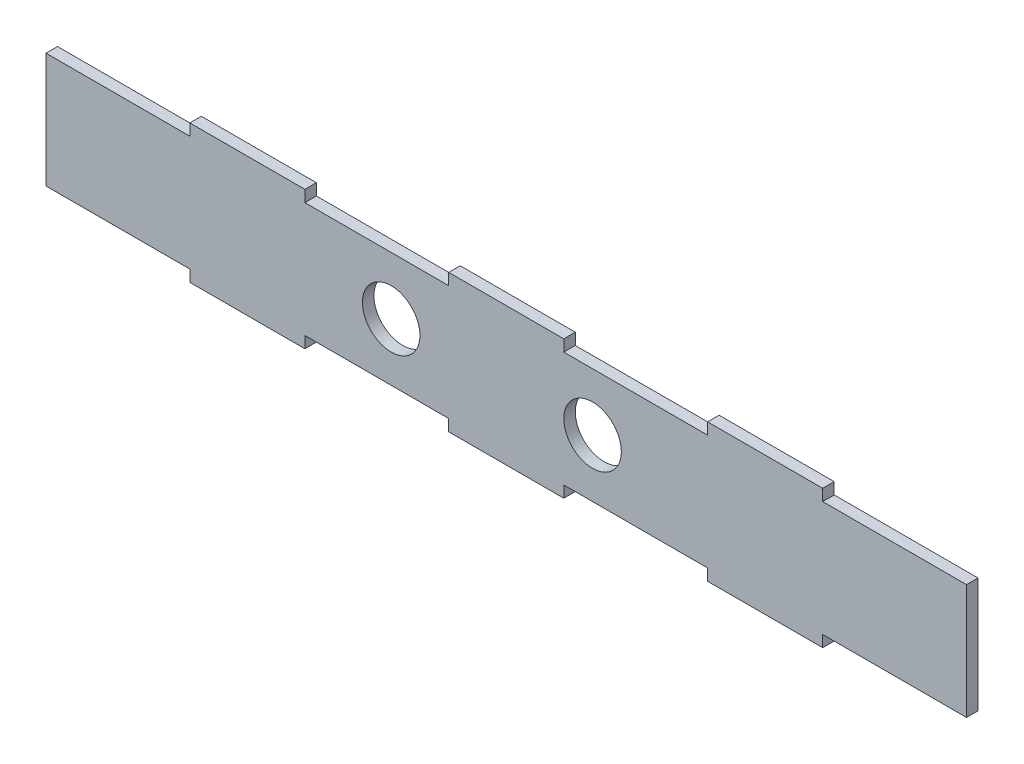
ISO-10303-21;
HEADER;
FILE_DESCRIPTION(('STEP AP214'),'2;1');
FILE_NAME('part.step','',(''),(''),'','','');
FILE_SCHEMA(('AUTOMOTIVE_DESIGN { 1 0 10303 214 1 1 1 1 }'));
ENDSEC;
DATA;
#1=APPLICATION_CONTEXT('core data for automotive mechanical design processes');
#2=APPLICATION_PROTOCOL_DEFINITION('international standard','automotive_design',2000,#1);
#3=PRODUCT_CONTEXT('',#1,'mechanical');
#4=PRODUCT('Part','Part','',(#3));
#5=PRODUCT_RELATED_PRODUCT_CATEGORY('part','',(#4));
#6=PRODUCT_DEFINITION_FORMATION('','',#4);
#7=PRODUCT_DEFINITION_CONTEXT('part definition',#1,'design');
#8=PRODUCT_DEFINITION('design','',#6,#7);
#9=PRODUCT_DEFINITION_SHAPE('','',#8);
#10=(LENGTH_UNIT() NAMED_UNIT(*) SI_UNIT(.MILLI.,.METRE.));
#11=(NAMED_UNIT(*) PLANE_ANGLE_UNIT() SI_UNIT($,.RADIAN.));
#12=(NAMED_UNIT(*) SI_UNIT($,.STERADIAN.) SOLID_ANGLE_UNIT());
#13=UNCERTAINTY_MEASURE_WITH_UNIT(LENGTH_MEASURE(1.E-05),#10,'distance_accuracy_value','');
#14=(GEOMETRIC_REPRESENTATION_CONTEXT(3) GLOBAL_UNCERTAINTY_ASSIGNED_CONTEXT((#13)) GLOBAL_UNIT_ASSIGNED_CONTEXT((#10,
#11,#12)) REPRESENTATION_CONTEXT('',''));
#15=CARTESIAN_POINT('',(0.,0.,0.));
#16=DIRECTION('',(0.,0.,1.));
#17=DIRECTION('',(1.,0.,0.));
#18=AXIS2_PLACEMENT_3D('',#15,#16,#17);
#19=CARTESIAN_POINT('',(0.,0.,2.));
#20=DIRECTION('',(0.,1.,0.));
#21=DIRECTION('',(0.,0.,1.));
#22=AXIS2_PLACEMENT_3D('',#19,#20,#21);
#23=PLANE('',#22);
#24=DIRECTION('',(1.,0.,0.));
#25=VECTOR('',#24,1.);
#26=CARTESIAN_POINT('',(0.,0.,0.));
#27=LINE('',#26,#25);
#28=CARTESIAN_POINT('',(115.,0.,0.));
#29=VERTEX_POINT('',#28);
#30=CARTESIAN_POINT('',(135.,0.,0.));
#31=VERTEX_POINT('',#30);
#32=EDGE_CURVE('E262',#29,#31,#27,.T.);
#33=ORIENTED_EDGE('',*,*,#32,.T.);
#34=DIRECTION('',(0.,0.,-1.));
#35=VECTOR('',#34,1.);
#36=CARTESIAN_POINT('',(135.,0.,2.));
#37=LINE('',#36,#35);
#38=CARTESIAN_POINT('',(135.,0.,2.));
#39=VERTEX_POINT('',#38);
#40=EDGE_CURVE('E11',#39,#31,#37,.T.);
#41=ORIENTED_EDGE('',*,*,#40,.F.);
#42=DIRECTION('',(1.,0.,0.));
#43=VECTOR('',#42,1.);
#44=CARTESIAN_POINT('',(0.,0.,2.));
#45=LINE('',#44,#43);
#46=CARTESIAN_POINT('',(115.,0.,2.));
#47=VERTEX_POINT('',#46);
#48=EDGE_CURVE('E454',#47,#39,#45,.T.);
#49=ORIENTED_EDGE('',*,*,#48,.F.);
#50=DIRECTION('',(0.,0.,-1.));
#51=VECTOR('',#50,1.);
#52=CARTESIAN_POINT('',(115.,0.,2.));
#53=LINE('',#52,#51);
#54=EDGE_CURVE('E54',#47,#29,#53,.T.);
#55=ORIENTED_EDGE('',*,*,#54,.T.);
#56=EDGE_LOOP('',(#33,#41,#49,#55));
#57=FACE_BOUND('',#56,.T.);
#58=ADVANCED_FACE('F37',(#57),#23,.F.);
#59=CARTESIAN_POINT('',(135.,0.,2.));
#60=DIRECTION('',(-1.,0.,0.));
#61=DIRECTION('',(0.,0.,1.));
#62=AXIS2_PLACEMENT_3D('',#59,#60,#61);
#63=PLANE('',#62);
#64=DIRECTION('',(0.,1.,0.));
#65=VECTOR('',#64,1.);
#66=CARTESIAN_POINT('',(135.,0.,0.));
#67=LINE('',#66,#65);
#68=CARTESIAN_POINT('',(135.,2.,0.));
#69=VERTEX_POINT('',#68);
#70=EDGE_CURVE('E264',#31,#69,#67,.T.);
#71=ORIENTED_EDGE('',*,*,#70,.T.);
#72=DIRECTION('',(0.,0.,-1.));
#73=VECTOR('',#72,1.);
#74=CARTESIAN_POINT('',(135.,2.,2.));
#75=LINE('',#74,#73);
#76=CARTESIAN_POINT('',(135.,2.,2.));
#77=VERTEX_POINT('',#76);
#78=EDGE_CURVE('E46',#77,#69,#75,.T.);
#79=ORIENTED_EDGE('',*,*,#78,.F.);
#80=DIRECTION('',(0.,1.,0.));
#81=VECTOR('',#80,1.);
#82=CARTESIAN_POINT('',(135.,0.,2.));
#83=LINE('',#82,#81);
#84=EDGE_CURVE('E153',#39,#77,#83,.T.);
#85=ORIENTED_EDGE('',*,*,#84,.F.);
#86=ORIENTED_EDGE('',*,*,#40,.T.);
#87=EDGE_LOOP('',(#71,#79,#85,#86));
#88=FACE_BOUND('',#87,.T.);
#89=ADVANCED_FACE('F388',(#88),#63,.F.);
#90=CARTESIAN_POINT('',(0.,2.,2.));
#91=DIRECTION('',(0.,-1.,0.));
#92=DIRECTION('',(0.,0.,-1.));
#93=AXIS2_PLACEMENT_3D('',#90,#91,#92);
#94=PLANE('',#93);
#95=DIRECTION('',(-1.,0.,0.));
#96=VECTOR('',#95,1.);
#97=CARTESIAN_POINT('',(0.,2.,0.));
#98=LINE('',#97,#96);
#99=CARTESIAN_POINT('',(160.,2.,0.));
#100=VERTEX_POINT('',#99);
#101=EDGE_CURVE('E269',#100,#69,#98,.T.);
#102=ORIENTED_EDGE('',*,*,#101,.F.);
#103=DIRECTION('',(0.,0.,-1.));
#104=VECTOR('',#103,1.);
#105=CARTESIAN_POINT('',(160.,2.,2.));
#106=LINE('',#105,#104);
#107=CARTESIAN_POINT('',(160.,2.,2.));
#108=VERTEX_POINT('',#107);
#109=EDGE_CURVE('E381',#108,#100,#106,.T.);
#110=ORIENTED_EDGE('',*,*,#109,.F.);
#111=DIRECTION('',(-1.,0.,0.));
#112=VECTOR('',#111,1.);
#113=CARTESIAN_POINT('',(0.,2.,2.));
#114=LINE('',#113,#112);
#115=EDGE_CURVE('E387',#108,#77,#114,.T.);
#116=ORIENTED_EDGE('',*,*,#115,.T.);
#117=ORIENTED_EDGE('',*,*,#78,.T.);
#118=EDGE_LOOP('',(#102,#110,#116,#117));
#119=FACE_BOUND('',#118,.T.);
#120=ADVANCED_FACE('F385',(#119),#94,.T.);
#121=CARTESIAN_POINT('',(160.,0.,2.));
#122=DIRECTION('',(-1.,0.,0.));
#123=DIRECTION('',(0.,0.,1.));
#124=AXIS2_PLACEMENT_3D('',#121,#122,#123);
#125=PLANE('',#124);
#126=DIRECTION('',(0.,1.,0.));
#127=VECTOR('',#126,1.);
#128=CARTESIAN_POINT('',(160.,0.,0.));
#129=LINE('',#128,#127);
#130=CARTESIAN_POINT('',(160.,22.,0.));
#131=VERTEX_POINT('',#130);
#132=EDGE_CURVE('E272',#100,#131,#129,.T.);
#133=ORIENTED_EDGE('',*,*,#132,.T.);
#134=DIRECTION('',(0.,0.,-1.));
#135=VECTOR('',#134,1.);
#136=CARTESIAN_POINT('',(160.,22.,2.));
#137=LINE('',#136,#135);
#138=CARTESIAN_POINT('',(160.,22.,2.));
#139=VERTEX_POINT('',#138);
#140=EDGE_CURVE('E378',#139,#131,#137,.T.);
#141=ORIENTED_EDGE('',*,*,#140,.F.);
#142=DIRECTION('',(0.,1.,0.));
#143=VECTOR('',#142,1.);
#144=CARTESIAN_POINT('',(160.,0.,2.));
#145=LINE('',#144,#143);
#146=EDGE_CURVE('E406',#108,#139,#145,.T.);
#147=ORIENTED_EDGE('',*,*,#146,.F.);
#148=ORIENTED_EDGE('',*,*,#109,.T.);
#149=EDGE_LOOP('',(#133,#141,#147,#148));
#150=FACE_BOUND('',#149,.T.);
#151=ADVANCED_FACE('F396',(#150),#125,.F.);
#152=CARTESIAN_POINT('',(0.,22.,2.));
#153=DIRECTION('',(0.,-1.,0.));
#154=DIRECTION('',(0.,0.,-1.));
#155=AXIS2_PLACEMENT_3D('',#152,#153,#154);
#156=PLANE('',#155);
#157=DIRECTION('',(-1.,0.,0.));
#158=VECTOR('',#157,1.);
#159=CARTESIAN_POINT('',(0.,22.,0.));
#160=LINE('',#159,#158);
#161=CARTESIAN_POINT('',(135.,22.,0.));
#162=VERTEX_POINT('',#161);
#163=EDGE_CURVE('E274',#131,#162,#160,.T.);
#164=ORIENTED_EDGE('',*,*,#163,.T.);
#165=DIRECTION('',(0.,0.,-1.));
#166=VECTOR('',#165,1.);
#167=CARTESIAN_POINT('',(135.,22.,2.));
#168=LINE('',#167,#166);
#169=CARTESIAN_POINT('',(135.,22.,2.));
#170=VERTEX_POINT('',#169);
#171=EDGE_CURVE('E376',#170,#162,#168,.T.);
#172=ORIENTED_EDGE('',*,*,#171,.F.);
#173=DIRECTION('',(-1.,0.,0.));
#174=VECTOR('',#173,1.);
#175=CARTESIAN_POINT('',(0.,22.,2.));
#176=LINE('',#175,#174);
#177=EDGE_CURVE('E402',#139,#170,#176,.T.);
#178=ORIENTED_EDGE('',*,*,#177,.F.);
#179=ORIENTED_EDGE('',*,*,#140,.T.);
#180=EDGE_LOOP('',(#164,#172,#178,#179));
#181=FACE_BOUND('',#180,.T.);
#182=ADVANCED_FACE('F400',(#181),#156,.F.);
#183=CARTESIAN_POINT('',(135.,0.,2.));
#184=DIRECTION('',(1.,0.,0.));
#185=DIRECTION('',(0.,0.,-1.));
#186=AXIS2_PLACEMENT_3D('',#183,#184,#185);
#187=PLANE('',#186);
#188=DIRECTION('',(0.,-1.,0.));
#189=VECTOR('',#188,1.);
#190=CARTESIAN_POINT('',(135.,0.,0.));
#191=LINE('',#190,#189);
#192=CARTESIAN_POINT('',(135.,24.,0.));
#193=VERTEX_POINT('',#192);
#194=EDGE_CURVE('E277',#193,#162,#191,.T.);
#195=ORIENTED_EDGE('',*,*,#194,.F.);
#196=DIRECTION('',(0.,0.,-1.));
#197=VECTOR('',#196,1.);
#198=CARTESIAN_POINT('',(135.,24.,2.));
#199=LINE('',#198,#197);
#200=CARTESIAN_POINT('',(135.,24.,2.));
#201=VERTEX_POINT('',#200);
#202=EDGE_CURVE('E374',#201,#193,#199,.T.);
#203=ORIENTED_EDGE('',*,*,#202,.F.);
#204=DIRECTION('',(0.,-1.,0.));
#205=VECTOR('',#204,1.);
#206=CARTESIAN_POINT('',(135.,0.,2.));
#207=LINE('',#206,#205);
#208=EDGE_CURVE('E405',#201,#170,#207,.T.);
#209=ORIENTED_EDGE('',*,*,#208,.T.);
#210=ORIENTED_EDGE('',*,*,#171,.T.);
#211=EDGE_LOOP('',(#195,#203,#209,#210));
#212=FACE_BOUND('',#211,.T.);
#213=ADVANCED_FACE('F564',(#212),#187,.T.);
#214=CARTESIAN_POINT('',(0.,24.,2.));
#215=DIRECTION('',(0.,1.,0.));
#216=DIRECTION('',(0.,0.,1.));
#217=AXIS2_PLACEMENT_3D('',#214,#215,#216);
#218=PLANE('',#217);
#219=DIRECTION('',(1.,0.,0.));
#220=VECTOR('',#219,1.);
#221=CARTESIAN_POINT('',(0.,24.,0.));
#222=LINE('',#221,#220);
#223=CARTESIAN_POINT('',(115.,24.,0.));
#224=VERTEX_POINT('',#223);
#225=EDGE_CURVE('E280',#224,#193,#222,.T.);
#226=ORIENTED_EDGE('',*,*,#225,.F.);
#227=DIRECTION('',(0.,0.,-1.));
#228=VECTOR('',#227,1.);
#229=CARTESIAN_POINT('',(115.,24.,2.));
#230=LINE('',#229,#228);
#231=CARTESIAN_POINT('',(115.,24.,2.));
#232=VERTEX_POINT('',#231);
#233=EDGE_CURVE('E372',#232,#224,#230,.T.);
#234=ORIENTED_EDGE('',*,*,#233,.F.);
#235=DIRECTION('',(1.,0.,0.));
#236=VECTOR('',#235,1.);
#237=CARTESIAN_POINT('',(0.,24.,2.));
#238=LINE('',#237,#236);
#239=EDGE_CURVE('E408',#232,#201,#238,.T.);
#240=ORIENTED_EDGE('',*,*,#239,.T.);
#241=ORIENTED_EDGE('',*,*,#202,.T.);
#242=EDGE_LOOP('',(#226,#234,#240,#241));
#243=FACE_BOUND('',#242,.T.);
#244=ADVANCED_FACE('F559',(#243),#218,.T.);
#245=CARTESIAN_POINT('',(115.,0.,2.));
#246=DIRECTION('',(1.,0.,0.));
#247=DIRECTION('',(0.,0.,-1.));
#248=AXIS2_PLACEMENT_3D('',#245,#246,#247);
#249=PLANE('',#248);
#250=DIRECTION('',(0.,-1.,0.));
#251=VECTOR('',#250,1.);
#252=CARTESIAN_POINT('',(115.,0.,0.));
#253=LINE('',#252,#251);
#254=CARTESIAN_POINT('',(115.,22.,0.));
#255=VERTEX_POINT('',#254);
#256=EDGE_CURVE('E283',#224,#255,#253,.T.);
#257=ORIENTED_EDGE('',*,*,#256,.T.);
#258=DIRECTION('',(0.,0.,-1.));
#259=VECTOR('',#258,1.);
#260=CARTESIAN_POINT('',(115.,22.,2.));
#261=LINE('',#260,#259);
#262=CARTESIAN_POINT('',(115.,22.,2.));
#263=VERTEX_POINT('',#262);
#264=EDGE_CURVE('E370',#263,#255,#261,.T.);
#265=ORIENTED_EDGE('',*,*,#264,.F.);
#266=DIRECTION('',(0.,-1.,0.));
#267=VECTOR('',#266,1.);
#268=CARTESIAN_POINT('',(115.,0.,2.));
#269=LINE('',#268,#267);
#270=EDGE_CURVE('E415',#232,#263,#269,.T.);
#271=ORIENTED_EDGE('',*,*,#270,.F.);
#272=ORIENTED_EDGE('',*,*,#233,.T.);
#273=EDGE_LOOP('',(#257,#265,#271,#272));
#274=FACE_BOUND('',#273,.T.);
#275=ADVANCED_FACE('F565',(#274),#249,.F.);
#276=CARTESIAN_POINT('',(0.,22.,2.));
#277=DIRECTION('',(0.,1.,0.));
#278=DIRECTION('',(-1.,0.,0.));
#279=AXIS2_PLACEMENT_3D('',#276,#277,#278);
#280=PLANE('',#279);
#281=DIRECTION('',(1.,0.,0.));
#282=VECTOR('',#281,1.);
#283=CARTESIAN_POINT('',(0.,22.,0.));
#284=LINE('',#283,#282);
#285=CARTESIAN_POINT('',(90.,22.,0.));
#286=VERTEX_POINT('',#285);
#287=EDGE_CURVE('E288',#286,#255,#284,.T.);
#288=ORIENTED_EDGE('',*,*,#287,.F.);
#289=DIRECTION('',(0.,0.,-1.));
#290=VECTOR('',#289,1.);
#291=CARTESIAN_POINT('',(90.,22.,2.));
#292=LINE('',#291,#290);
#293=CARTESIAN_POINT('',(90.,22.,2.));
#294=VERTEX_POINT('',#293);
#295=EDGE_CURVE('E368',#294,#286,#292,.T.);
#296=ORIENTED_EDGE('',*,*,#295,.F.);
#297=DIRECTION('',(1.,0.,0.));
#298=VECTOR('',#297,1.);
#299=CARTESIAN_POINT('',(0.,22.,2.));
#300=LINE('',#299,#298);
#301=EDGE_CURVE('E419',#294,#263,#300,.T.);
#302=ORIENTED_EDGE('',*,*,#301,.T.);
#303=ORIENTED_EDGE('',*,*,#264,.T.);
#304=EDGE_LOOP('',(#288,#296,#302,#303));
#305=FACE_BOUND('',#304,.T.);
#306=ADVANCED_FACE('F553',(#305),#280,.T.);
#307=CARTESIAN_POINT('',(90.,0.,2.));
#308=DIRECTION('',(1.,0.,0.));
#309=DIRECTION('',(0.,0.,-1.));
#310=AXIS2_PLACEMENT_3D('',#307,#308,#309);
#311=PLANE('',#310);
#312=DIRECTION('',(0.,-1.,0.));
#313=VECTOR('',#312,1.);
#314=CARTESIAN_POINT('',(90.,0.,0.));
#315=LINE('',#314,#313);
#316=CARTESIAN_POINT('',(90.,24.,0.));
#317=VERTEX_POINT('',#316);
#318=EDGE_CURVE('E291',#317,#286,#315,.T.);
#319=ORIENTED_EDGE('',*,*,#318,.F.);
#320=DIRECTION('',(0.,0.,-1.));
#321=VECTOR('',#320,1.);
#322=CARTESIAN_POINT('',(90.,24.,2.));
#323=LINE('',#322,#321);
#324=CARTESIAN_POINT('',(90.,24.,2.));
#325=VERTEX_POINT('',#324);
#326=EDGE_CURVE('E366',#325,#317,#323,.T.);
#327=ORIENTED_EDGE('',*,*,#326,.F.);
#328=DIRECTION('',(0.,-1.,0.));
#329=VECTOR('',#328,1.);
#330=CARTESIAN_POINT('',(90.,0.,2.));
#331=LINE('',#330,#329);
#332=EDGE_CURVE('E422',#325,#294,#331,.T.);
#333=ORIENTED_EDGE('',*,*,#332,.T.);
#334=ORIENTED_EDGE('',*,*,#295,.T.);
#335=EDGE_LOOP('',(#319,#327,#333,#334));
#336=FACE_BOUND('',#335,.T.);
#337=ADVANCED_FACE('F549',(#336),#311,.T.);
#338=CARTESIAN_POINT('',(70.,24.,0.));
#339=VERTEX_POINT('',#338);
#340=EDGE_CURVE('E285',#339,#317,#222,.T.);
#341=ORIENTED_EDGE('',*,*,#340,.F.);
#342=DIRECTION('',(0.,0.,-1.));
#343=VECTOR('',#342,1.);
#344=CARTESIAN_POINT('',(70.,24.,2.));
#345=LINE('',#344,#343);
#346=CARTESIAN_POINT('',(70.,24.,2.));
#347=VERTEX_POINT('',#346);
#348=EDGE_CURVE('E364',#347,#339,#345,.T.);
#349=ORIENTED_EDGE('',*,*,#348,.F.);
#350=EDGE_CURVE('E417',#347,#325,#238,.T.);
#351=ORIENTED_EDGE('',*,*,#350,.T.);
#352=ORIENTED_EDGE('',*,*,#326,.T.);
#353=EDGE_LOOP('',(#341,#349,#351,#352));
#354=FACE_BOUND('',#353,.T.);
#355=ADVANCED_FACE('F543',(#354),#218,.T.);
#356=CARTESIAN_POINT('',(70.,0.,2.));
#357=DIRECTION('',(1.,0.,0.));
#358=DIRECTION('',(0.,0.,-1.));
#359=AXIS2_PLACEMENT_3D('',#356,#357,#358);
#360=PLANE('',#359);
#361=DIRECTION('',(0.,-1.,0.));
#362=VECTOR('',#361,1.);
#363=CARTESIAN_POINT('',(70.,0.,0.));
#364=LINE('',#363,#362);
#365=CARTESIAN_POINT('',(70.,22.,0.));
#366=VERTEX_POINT('',#365);
#367=EDGE_CURVE('E294',#339,#366,#364,.T.);
#368=ORIENTED_EDGE('',*,*,#367,.T.);
#369=DIRECTION('',(0.,0.,-1.));
#370=VECTOR('',#369,1.);
#371=CARTESIAN_POINT('',(70.,22.,2.));
#372=LINE('',#371,#370);
#373=CARTESIAN_POINT('',(70.,22.,2.));
#374=VERTEX_POINT('',#373);
#375=EDGE_CURVE('E362',#374,#366,#372,.T.);
#376=ORIENTED_EDGE('',*,*,#375,.F.);
#377=DIRECTION('',(0.,-1.,0.));
#378=VECTOR('',#377,1.);
#379=CARTESIAN_POINT('',(70.,0.,2.));
#380=LINE('',#379,#378);
#381=EDGE_CURVE('E425',#347,#374,#380,.T.);
#382=ORIENTED_EDGE('',*,*,#381,.F.);
#383=ORIENTED_EDGE('',*,*,#348,.T.);
#384=EDGE_LOOP('',(#368,#376,#382,#383));
#385=FACE_BOUND('',#384,.T.);
#386=ADVANCED_FACE('F700',(#385),#360,.F.);
#387=CARTESIAN_POINT('',(0.,22.,2.));
#388=DIRECTION('',(0.,1.,0.));
#389=DIRECTION('',(0.,0.,1.));
#390=AXIS2_PLACEMENT_3D('',#387,#388,#389);
#391=PLANE('',#390);
#392=DIRECTION('',(1.,0.,0.));
#393=VECTOR('',#392,1.);
#394=CARTESIAN_POINT('',(0.,22.,0.));
#395=LINE('',#394,#393);
#396=CARTESIAN_POINT('',(45.,22.,0.));
#397=VERTEX_POINT('',#396);
#398=EDGE_CURVE('E297',#397,#366,#395,.T.);
#399=ORIENTED_EDGE('',*,*,#398,.F.);
#400=DIRECTION('',(0.,0.,-1.));
#401=VECTOR('',#400,1.);
#402=CARTESIAN_POINT('',(45.,22.,2.));
#403=LINE('',#402,#401);
#404=CARTESIAN_POINT('',(45.,22.,2.));
#405=VERTEX_POINT('',#404);
#406=EDGE_CURVE('E360',#405,#397,#403,.T.);
#407=ORIENTED_EDGE('',*,*,#406,.F.);
#408=DIRECTION('',(1.,0.,0.));
#409=VECTOR('',#408,1.);
#410=CARTESIAN_POINT('',(0.,22.,2.));
#411=LINE('',#410,#409);
#412=EDGE_CURVE('E427',#405,#374,#411,.T.);
#413=ORIENTED_EDGE('',*,*,#412,.T.);
#414=ORIENTED_EDGE('',*,*,#375,.T.);
#415=EDGE_LOOP('',(#399,#407,#413,#414));
#416=FACE_BOUND('',#415,.T.);
#417=ADVANCED_FACE('F690',(#416),#391,.T.);
#418=CARTESIAN_POINT('',(45.,0.,2.));
#419=DIRECTION('',(1.,0.,0.));
#420=DIRECTION('',(0.,0.,-1.));
#421=AXIS2_PLACEMENT_3D('',#418,#419,#420);
#422=PLANE('',#421);
#423=DIRECTION('',(0.,-1.,0.));
#424=VECTOR('',#423,1.);
#425=CARTESIAN_POINT('',(45.,0.,0.));
#426=LINE('',#425,#424);
#427=CARTESIAN_POINT('',(45.,24.,0.));
#428=VERTEX_POINT('',#427);
#429=EDGE_CURVE('E300',#428,#397,#426,.T.);
#430=ORIENTED_EDGE('',*,*,#429,.F.);
#431=DIRECTION('',(0.,0.,-1.));
#432=VECTOR('',#431,1.);
#433=CARTESIAN_POINT('',(45.,24.,2.));
#434=LINE('',#433,#432);
#435=CARTESIAN_POINT('',(45.,24.,2.));
#436=VERTEX_POINT('',#435);
#437=EDGE_CURVE('E358',#436,#428,#434,.T.);
#438=ORIENTED_EDGE('',*,*,#437,.F.);
#439=DIRECTION('',(0.,-1.,0.));
#440=VECTOR('',#439,1.);
#441=CARTESIAN_POINT('',(45.,0.,2.));
#442=LINE('',#441,#440);
#443=EDGE_CURVE('E430',#436,#405,#442,.T.);
#444=ORIENTED_EDGE('',*,*,#443,.T.);
#445=ORIENTED_EDGE('',*,*,#406,.T.);
#446=EDGE_LOOP('',(#430,#438,#444,#445));
#447=FACE_BOUND('',#446,.T.);
#448=ADVANCED_FACE('F682',(#447),#422,.T.);
#449=CARTESIAN_POINT('',(25.,24.,0.));
#450=VERTEX_POINT('',#449);
#451=EDGE_CURVE('E284',#450,#428,#222,.T.);
#452=ORIENTED_EDGE('',*,*,#451,.F.);
#453=DIRECTION('',(0.,0.,-1.));
#454=VECTOR('',#453,1.);
#455=CARTESIAN_POINT('',(25.,24.,2.));
#456=LINE('',#455,#454);
#457=CARTESIAN_POINT('',(25.,24.,2.));
#458=VERTEX_POINT('',#457);
#459=EDGE_CURVE('E356',#458,#450,#456,.T.);
#460=ORIENTED_EDGE('',*,*,#459,.F.);
#461=EDGE_CURVE('E416',#458,#436,#238,.T.);
#462=ORIENTED_EDGE('',*,*,#461,.T.);
#463=ORIENTED_EDGE('',*,*,#437,.T.);
#464=EDGE_LOOP('',(#452,#460,#462,#463));
#465=FACE_BOUND('',#464,.T.);
#466=ADVANCED_FACE('F534',(#465),#218,.T.);
#467=CARTESIAN_POINT('',(25.,0.,2.));
#468=DIRECTION('',(1.,0.,0.));
#469=DIRECTION('',(0.,0.,-1.));
#470=AXIS2_PLACEMENT_3D('',#467,#468,#469);
#471=PLANE('',#470);
#472=DIRECTION('',(0.,-1.,0.));
#473=VECTOR('',#472,1.);
#474=CARTESIAN_POINT('',(25.,0.,0.));
#475=LINE('',#474,#473);
#476=CARTESIAN_POINT('',(25.,22.,0.));
#477=VERTEX_POINT('',#476);
#478=EDGE_CURVE('E303',#450,#477,#475,.T.);
#479=ORIENTED_EDGE('',*,*,#478,.T.);
#480=DIRECTION('',(0.,0.,-1.));
#481=VECTOR('',#480,1.);
#482=CARTESIAN_POINT('',(25.,22.,2.));
#483=LINE('',#482,#481);
#484=CARTESIAN_POINT('',(25.,22.,2.));
#485=VERTEX_POINT('',#484);
#486=EDGE_CURVE('E354',#485,#477,#483,.T.);
#487=ORIENTED_EDGE('',*,*,#486,.F.);
#488=DIRECTION('',(0.,-1.,0.));
#489=VECTOR('',#488,1.);
#490=CARTESIAN_POINT('',(25.,0.,2.));
#491=LINE('',#490,#489);
#492=EDGE_CURVE('E433',#458,#485,#491,.T.);
#493=ORIENTED_EDGE('',*,*,#492,.F.);
#494=ORIENTED_EDGE('',*,*,#459,.T.);
#495=EDGE_LOOP('',(#479,#487,#493,#494));
#496=FACE_BOUND('',#495,.T.);
#497=ADVANCED_FACE('F665',(#496),#471,.F.);
#498=CARTESIAN_POINT('',(0.,22.,2.));
#499=DIRECTION('',(0.,1.,0.));
#500=DIRECTION('',(0.,0.,1.));
#501=AXIS2_PLACEMENT_3D('',#498,#499,#500);
#502=PLANE('',#501);
#503=DIRECTION('',(1.,0.,0.));
#504=VECTOR('',#503,1.);
#505=CARTESIAN_POINT('',(0.,22.,0.));
#506=LINE('',#505,#504);
#507=CARTESIAN_POINT('',(0.,22.,0.));
#508=VERTEX_POINT('',#507);
#509=EDGE_CURVE('E306',#508,#477,#506,.T.);
#510=ORIENTED_EDGE('',*,*,#509,.F.);
#511=DIRECTION('',(0.,0.,-1.));
#512=VECTOR('',#511,1.);
#513=CARTESIAN_POINT('',(0.,22.,2.));
#514=LINE('',#513,#512);
#515=CARTESIAN_POINT('',(0.,22.,2.));
#516=VERTEX_POINT('',#515);
#517=EDGE_CURVE('E352',#516,#508,#514,.T.);
#518=ORIENTED_EDGE('',*,*,#517,.F.);
#519=DIRECTION('',(1.,0.,0.));
#520=VECTOR('',#519,1.);
#521=CARTESIAN_POINT('',(0.,22.,2.));
#522=LINE('',#521,#520);
#523=EDGE_CURVE('E435',#516,#485,#522,.T.);
#524=ORIENTED_EDGE('',*,*,#523,.T.);
#525=ORIENTED_EDGE('',*,*,#486,.T.);
#526=EDGE_LOOP('',(#510,#518,#524,#525));
#527=FACE_BOUND('',#526,.T.);
#528=ADVANCED_FACE('F527',(#527),#502,.T.);
#529=CARTESIAN_POINT('',(0.,0.,2.));
#530=DIRECTION('',(-1.,0.,0.));
#531=DIRECTION('',(0.,0.,1.));
#532=AXIS2_PLACEMENT_3D('',#529,#530,#531);
#533=PLANE('',#532);
#534=DIRECTION('',(0.,1.,0.));
#535=VECTOR('',#534,1.);
#536=CARTESIAN_POINT('',(0.,0.,0.));
#537=LINE('',#536,#535);
#538=CARTESIAN_POINT('',(0.,2.,0.));
#539=VERTEX_POINT('',#538);
#540=EDGE_CURVE('E309',#539,#508,#537,.T.);
#541=ORIENTED_EDGE('',*,*,#540,.F.);
#542=DIRECTION('',(0.,0.,-1.));
#543=VECTOR('',#542,1.);
#544=CARTESIAN_POINT('',(0.,2.,2.));
#545=LINE('',#544,#543);
#546=CARTESIAN_POINT('',(0.,2.,2.));
#547=VERTEX_POINT('',#546);
#548=EDGE_CURVE('E350',#547,#539,#545,.T.);
#549=ORIENTED_EDGE('',*,*,#548,.F.);
#550=DIRECTION('',(0.,1.,0.));
#551=VECTOR('',#550,1.);
#552=CARTESIAN_POINT('',(0.,0.,2.));
#553=LINE('',#552,#551);
#554=EDGE_CURVE('E438',#547,#516,#553,.T.);
#555=ORIENTED_EDGE('',*,*,#554,.T.);
#556=ORIENTED_EDGE('',*,*,#517,.T.);
#557=EDGE_LOOP('',(#541,#549,#555,#556));
#558=FACE_BOUND('',#557,.T.);
#559=ADVANCED_FACE('F523',(#558),#533,.T.);
#560=CARTESIAN_POINT('',(0.,2.,2.));
#561=DIRECTION('',(0.,1.,0.));
#562=DIRECTION('',(0.,0.,1.));
#563=AXIS2_PLACEMENT_3D('',#560,#561,#562);
#564=PLANE('',#563);
#565=DIRECTION('',(1.,0.,0.));
#566=VECTOR('',#565,1.);
#567=CARTESIAN_POINT('',(0.,2.,0.));
#568=LINE('',#567,#566);
#569=CARTESIAN_POINT('',(25.,2.,0.));
#570=VERTEX_POINT('',#569);
#571=EDGE_CURVE('E312',#539,#570,#568,.T.);
#572=ORIENTED_EDGE('',*,*,#571,.T.);
#573=DIRECTION('',(0.,0.,-1.));
#574=VECTOR('',#573,1.);
#575=CARTESIAN_POINT('',(25.,2.,2.));
#576=LINE('',#575,#574);
#577=CARTESIAN_POINT('',(25.,2.,2.));
#578=VERTEX_POINT('',#577);
#579=EDGE_CURVE('E348',#578,#570,#576,.T.);
#580=ORIENTED_EDGE('',*,*,#579,.F.);
#581=DIRECTION('',(1.,0.,0.));
#582=VECTOR('',#581,1.);
#583=CARTESIAN_POINT('',(0.,2.,2.));
#584=LINE('',#583,#582);
#585=EDGE_CURVE('E441',#547,#578,#584,.T.);
#586=ORIENTED_EDGE('',*,*,#585,.F.);
#587=ORIENTED_EDGE('',*,*,#548,.T.);
#588=EDGE_LOOP('',(#572,#580,#586,#587));
#589=FACE_BOUND('',#588,.T.);
#590=ADVANCED_FACE('F640',(#589),#564,.F.);
#591=CARTESIAN_POINT('',(25.,0.,2.));
#592=DIRECTION('',(-1.,0.,0.));
#593=DIRECTION('',(0.,0.,1.));
#594=AXIS2_PLACEMENT_3D('',#591,#592,#593);
#595=PLANE('',#594);
#596=DIRECTION('',(0.,1.,0.));
#597=VECTOR('',#596,1.);
#598=CARTESIAN_POINT('',(25.,0.,0.));
#599=LINE('',#598,#597);
#600=CARTESIAN_POINT('',(25.,0.,0.));
#601=VERTEX_POINT('',#600);
#602=EDGE_CURVE('E315',#601,#570,#599,.T.);
#603=ORIENTED_EDGE('',*,*,#602,.F.);
#604=DIRECTION('',(0.,0.,-1.));
#605=VECTOR('',#604,1.);
#606=CARTESIAN_POINT('',(25.,0.,2.));
#607=LINE('',#606,#605);
#608=CARTESIAN_POINT('',(25.,0.,2.));
#609=VERTEX_POINT('',#608);
#610=EDGE_CURVE('E346',#609,#601,#607,.T.);
#611=ORIENTED_EDGE('',*,*,#610,.F.);
#612=DIRECTION('',(0.,1.,0.));
#613=VECTOR('',#612,1.);
#614=CARTESIAN_POINT('',(25.,0.,2.));
#615=LINE('',#614,#613);
#616=EDGE_CURVE('E443',#609,#578,#615,.T.);
#617=ORIENTED_EDGE('',*,*,#616,.T.);
#618=ORIENTED_EDGE('',*,*,#579,.T.);
#619=EDGE_LOOP('',(#603,#611,#617,#618));
#620=FACE_BOUND('',#619,.T.);
#621=ADVANCED_FACE('F490',(#620),#595,.T.);
#622=CARTESIAN_POINT('',(45.,0.,0.));
#623=VERTEX_POINT('',#622);
#624=EDGE_CURVE('E266',#601,#623,#27,.T.);
#625=ORIENTED_EDGE('',*,*,#624,.T.);
#626=DIRECTION('',(0.,0.,-1.));
#627=VECTOR('',#626,1.);
#628=CARTESIAN_POINT('',(45.,0.,2.));
#629=LINE('',#628,#627);
#630=CARTESIAN_POINT('',(45.,0.,2.));
#631=VERTEX_POINT('',#630);
#632=EDGE_CURVE('E343',#631,#623,#629,.T.);
#633=ORIENTED_EDGE('',*,*,#632,.F.);
#634=EDGE_CURVE('E446',#609,#631,#45,.T.);
#635=ORIENTED_EDGE('',*,*,#634,.F.);
#636=ORIENTED_EDGE('',*,*,#610,.T.);
#637=EDGE_LOOP('',(#625,#633,#635,#636));
#638=FACE_BOUND('',#637,.T.);
#639=ADVANCED_FACE('F480',(#638),#23,.F.);
#640=CARTESIAN_POINT('',(45.,0.,2.));
#641=DIRECTION('',(-1.,0.,0.));
#642=DIRECTION('',(0.,0.,1.));
#643=AXIS2_PLACEMENT_3D('',#640,#641,#642);
#644=PLANE('',#643);
#645=DIRECTION('',(0.,1.,0.));
#646=VECTOR('',#645,1.);
#647=CARTESIAN_POINT('',(45.,0.,0.));
#648=LINE('',#647,#646);
#649=CARTESIAN_POINT('',(45.,2.,0.));
#650=VERTEX_POINT('',#649);
#651=EDGE_CURVE('E318',#623,#650,#648,.T.);
#652=ORIENTED_EDGE('',*,*,#651,.T.);
#653=DIRECTION('',(0.,0.,-1.));
#654=VECTOR('',#653,1.);
#655=CARTESIAN_POINT('',(45.,2.,2.));
#656=LINE('',#655,#654);
#657=CARTESIAN_POINT('',(45.,2.,2.));
#658=VERTEX_POINT('',#657);
#659=EDGE_CURVE('E340',#658,#650,#656,.T.);
#660=ORIENTED_EDGE('',*,*,#659,.F.);
#661=DIRECTION('',(0.,1.,0.));
#662=VECTOR('',#661,1.);
#663=CARTESIAN_POINT('',(45.,0.,2.));
#664=LINE('',#663,#662);
#665=EDGE_CURVE('E447',#631,#658,#664,.T.);
#666=ORIENTED_EDGE('',*,*,#665,.F.);
#667=ORIENTED_EDGE('',*,*,#632,.T.);
#668=EDGE_LOOP('',(#652,#660,#666,#667));
#669=FACE_BOUND('',#668,.T.);
#670=ADVANCED_FACE('F489',(#669),#644,.F.);
#671=CARTESIAN_POINT('',(0.,2.,2.));
#672=DIRECTION('',(0.,1.,0.));
#673=DIRECTION('',(0.,0.,1.));
#674=AXIS2_PLACEMENT_3D('',#671,#672,#673);
#675=PLANE('',#674);
#676=DIRECTION('',(1.,0.,0.));
#677=VECTOR('',#676,1.);
#678=CARTESIAN_POINT('',(0.,2.,0.));
#679=LINE('',#678,#677);
#680=CARTESIAN_POINT('',(70.,2.,0.));
#681=VERTEX_POINT('',#680);
#682=EDGE_CURVE('E320',#650,#681,#679,.T.);
#683=ORIENTED_EDGE('',*,*,#682,.T.);
#684=DIRECTION('',(0.,0.,-1.));
#685=VECTOR('',#684,1.);
#686=CARTESIAN_POINT('',(70.,2.,2.));
#687=LINE('',#686,#685);
#688=CARTESIAN_POINT('',(70.,2.,2.));
#689=VERTEX_POINT('',#688);
#690=EDGE_CURVE('E338',#689,#681,#687,.T.);
#691=ORIENTED_EDGE('',*,*,#690,.F.);
#692=DIRECTION('',(1.,0.,0.));
#693=VECTOR('',#692,1.);
#694=CARTESIAN_POINT('',(0.,2.,2.));
#695=LINE('',#694,#693);
#696=EDGE_CURVE('E449',#658,#689,#695,.T.);
#697=ORIENTED_EDGE('',*,*,#696,.F.);
#698=ORIENTED_EDGE('',*,*,#659,.T.);
#699=EDGE_LOOP('',(#683,#691,#697,#698));
#700=FACE_BOUND('',#699,.T.);
#701=ADVANCED_FACE('F499',(#700),#675,.F.);
#702=CARTESIAN_POINT('',(70.,0.,2.));
#703=DIRECTION('',(-1.,0.,0.));
#704=DIRECTION('',(0.,0.,1.));
#705=AXIS2_PLACEMENT_3D('',#702,#703,#704);
#706=PLANE('',#705);
#707=DIRECTION('',(0.,1.,0.));
#708=VECTOR('',#707,1.);
#709=CARTESIAN_POINT('',(70.,0.,0.));
#710=LINE('',#709,#708);
#711=CARTESIAN_POINT('',(70.,0.,0.));
#712=VERTEX_POINT('',#711);
#713=EDGE_CURVE('E323',#712,#681,#710,.T.);
#714=ORIENTED_EDGE('',*,*,#713,.F.);
#715=DIRECTION('',(0.,0.,-1.));
#716=VECTOR('',#715,1.);
#717=CARTESIAN_POINT('',(70.,0.,2.));
#718=LINE('',#717,#716);
#719=CARTESIAN_POINT('',(70.,0.,2.));
#720=VERTEX_POINT('',#719);
#721=EDGE_CURVE('E336',#720,#712,#718,.T.);
#722=ORIENTED_EDGE('',*,*,#721,.F.);
#723=DIRECTION('',(0.,1.,0.));
#724=VECTOR('',#723,1.);
#725=CARTESIAN_POINT('',(70.,0.,2.));
#726=LINE('',#725,#724);
#727=EDGE_CURVE('E450',#720,#689,#726,.T.);
#728=ORIENTED_EDGE('',*,*,#727,.T.);
#729=ORIENTED_EDGE('',*,*,#690,.T.);
#730=EDGE_LOOP('',(#714,#722,#728,#729));
#731=FACE_BOUND('',#730,.T.);
#732=ADVANCED_FACE('F493',(#731),#706,.T.);
#733=CARTESIAN_POINT('',(90.,0.,0.));
#734=VERTEX_POINT('',#733);
#735=EDGE_CURVE('E265',#712,#734,#27,.T.);
#736=ORIENTED_EDGE('',*,*,#735,.T.);
#737=DIRECTION('',(0.,0.,-1.));
#738=VECTOR('',#737,1.);
#739=CARTESIAN_POINT('',(90.,0.,2.));
#740=LINE('',#739,#738);
#741=CARTESIAN_POINT('',(90.,0.,2.));
#742=VERTEX_POINT('',#741);
#743=EDGE_CURVE('E248',#742,#734,#740,.T.);
#744=ORIENTED_EDGE('',*,*,#743,.F.);
#745=EDGE_CURVE('E236',#720,#742,#45,.T.);
#746=ORIENTED_EDGE('',*,*,#745,.F.);
#747=ORIENTED_EDGE('',*,*,#721,.T.);
#748=EDGE_LOOP('',(#736,#744,#746,#747));
#749=FACE_BOUND('',#748,.T.);
#750=ADVANCED_FACE('F481',(#749),#23,.F.);
#751=CARTESIAN_POINT('',(90.,0.,2.));
#752=DIRECTION('',(-1.,0.,0.));
#753=DIRECTION('',(0.,0.,1.));
#754=AXIS2_PLACEMENT_3D('',#751,#752,#753);
#755=PLANE('',#754);
#756=DIRECTION('',(0.,1.,0.));
#757=VECTOR('',#756,1.);
#758=CARTESIAN_POINT('',(90.,0.,0.));
#759=LINE('',#758,#757);
#760=CARTESIAN_POINT('',(90.,2.,0.));
#761=VERTEX_POINT('',#760);
#762=EDGE_CURVE('E245',#734,#761,#759,.T.);
#763=ORIENTED_EDGE('',*,*,#762,.T.);
#764=DIRECTION('',(0.,0.,-1.));
#765=VECTOR('',#764,1.);
#766=CARTESIAN_POINT('',(90.,2.,2.));
#767=LINE('',#766,#765);
#768=CARTESIAN_POINT('',(90.,2.,2.));
#769=VERTEX_POINT('',#768);
#770=EDGE_CURVE('E242',#769,#761,#767,.T.);
#771=ORIENTED_EDGE('',*,*,#770,.F.);
#772=DIRECTION('',(0.,1.,0.));
#773=VECTOR('',#772,1.);
#774=CARTESIAN_POINT('',(90.,0.,2.));
#775=LINE('',#774,#773);
#776=EDGE_CURVE('E228',#742,#769,#775,.T.);
#777=ORIENTED_EDGE('',*,*,#776,.F.);
#778=ORIENTED_EDGE('',*,*,#743,.T.);
#779=EDGE_LOOP('',(#763,#771,#777,#778));
#780=FACE_BOUND('',#779,.T.);
#781=ADVANCED_FACE('F243',(#780),#755,.F.);
#782=CARTESIAN_POINT('',(0.,2.,2.));
#783=DIRECTION('',(0.,1.,0.));
#784=DIRECTION('',(0.,0.,1.));
#785=AXIS2_PLACEMENT_3D('',#782,#783,#784);
#786=PLANE('',#785);
#787=DIRECTION('',(1.,0.,0.));
#788=VECTOR('',#787,1.);
#789=CARTESIAN_POINT('',(0.,2.,0.));
#790=LINE('',#789,#788);
#791=CARTESIAN_POINT('',(115.,2.,0.));
#792=VERTEX_POINT('',#791);
#793=EDGE_CURVE('E327',#761,#792,#790,.T.);
#794=ORIENTED_EDGE('',*,*,#793,.T.);
#795=DIRECTION('',(0.,0.,-1.));
#796=VECTOR('',#795,1.);
#797=CARTESIAN_POINT('',(115.,2.,2.));
#798=LINE('',#797,#796);
#799=CARTESIAN_POINT('',(115.,2.,2.));
#800=VERTEX_POINT('',#799);
#801=EDGE_CURVE('E141',#800,#792,#798,.T.);
#802=ORIENTED_EDGE('',*,*,#801,.F.);
#803=DIRECTION('',(1.,0.,0.));
#804=VECTOR('',#803,1.);
#805=CARTESIAN_POINT('',(0.,2.,2.));
#806=LINE('',#805,#804);
#807=EDGE_CURVE('E233',#769,#800,#806,.T.);
#808=ORIENTED_EDGE('',*,*,#807,.F.);
#809=ORIENTED_EDGE('',*,*,#770,.T.);
#810=EDGE_LOOP('',(#794,#802,#808,#809));
#811=FACE_BOUND('',#810,.T.);
#812=ADVANCED_FACE('F250',(#811),#786,.F.);
#813=CARTESIAN_POINT('',(95.,12.,2.));
#814=DIRECTION('',(0.,0.,-1.));
#815=DIRECTION('',(-1.,0.,0.));
#816=AXIS2_PLACEMENT_3D('',#813,#814,#815);
#817=CYLINDRICAL_SURFACE('',#816,5.);
#818=CARTESIAN_POINT('',(95.,12.,2.));
#819=DIRECTION('',(0.,0.,1.));
#820=DIRECTION('',(1.,0.,0.));
#821=AXIS2_PLACEMENT_3D('',#818,#819,#820);
#822=CIRCLE('',#821,5.);
#823=CARTESIAN_POINT('',(100.,12.,2.));
#824=VERTEX_POINT('',#823);
#825=EDGE_CURVE('E457',#824,#824,#822,.T.);
#826=ORIENTED_EDGE('',*,*,#825,.T.);
#827=EDGE_LOOP('',(#826));
#828=FACE_BOUND('',#827,.T.);
#829=CARTESIAN_POINT('',(95.,12.,0.));
#830=DIRECTION('',(0.,0.,1.));
#831=DIRECTION('',(1.,0.,0.));
#832=AXIS2_PLACEMENT_3D('',#829,#830,#831);
#833=CIRCLE('',#832,5.);
#834=CARTESIAN_POINT('',(100.,12.,0.));
#835=VERTEX_POINT('',#834);
#836=EDGE_CURVE('E259',#835,#835,#833,.T.);
#837=ORIENTED_EDGE('',*,*,#836,.F.);
#838=EDGE_LOOP('',(#837));
#839=FACE_BOUND('',#838,.T.);
#840=ADVANCED_FACE('F583',(#828,#839),#817,.F.);
#841=CARTESIAN_POINT('',(60.,12.,2.));
#842=DIRECTION('',(0.,0.,-1.));
#843=DIRECTION('',(-1.,0.,0.));
#844=AXIS2_PLACEMENT_3D('',#841,#842,#843);
#845=CYLINDRICAL_SURFACE('',#844,4.99999999999999);
#846=CARTESIAN_POINT('',(60.,12.,2.));
#847=DIRECTION('',(0.,0.,1.));
#848=DIRECTION('',(1.,0.,0.));
#849=AXIS2_PLACEMENT_3D('',#846,#847,#848);
#850=CIRCLE('',#849,4.99999999999999);
#851=CARTESIAN_POINT('',(65.,12.,2.));
#852=VERTEX_POINT('',#851);
#853=EDGE_CURVE('E332',#852,#852,#850,.T.);
#854=ORIENTED_EDGE('',*,*,#853,.T.);
#855=EDGE_LOOP('',(#854));
#856=FACE_BOUND('',#855,.T.);
#857=CARTESIAN_POINT('',(60.,12.,0.));
#858=DIRECTION('',(0.,0.,1.));
#859=DIRECTION('',(1.,0.,0.));
#860=AXIS2_PLACEMENT_3D('',#857,#858,#859);
#861=CIRCLE('',#860,4.99999999999999);
#862=CARTESIAN_POINT('',(65.,12.,0.));
#863=VERTEX_POINT('',#862);
#864=EDGE_CURVE('E256',#863,#863,#861,.T.);
#865=ORIENTED_EDGE('',*,*,#864,.F.);
#866=EDGE_LOOP('',(#865));
#867=FACE_BOUND('',#866,.T.);
#868=ADVANCED_FACE('F39',(#856,#867),#845,.F.);
#869=CARTESIAN_POINT('',(115.,0.,2.));
#870=DIRECTION('',(-1.,0.,0.));
#871=DIRECTION('',(0.,0.,1.));
#872=AXIS2_PLACEMENT_3D('',#869,#870,#871);
#873=PLANE('',#872);
#874=DIRECTION('',(0.,1.,0.));
#875=VECTOR('',#874,1.);
#876=CARTESIAN_POINT('',(115.,0.,0.));
#877=LINE('',#876,#875);
#878=EDGE_CURVE('E329',#29,#792,#877,.T.);
#879=ORIENTED_EDGE('',*,*,#878,.F.);
#880=ORIENTED_EDGE('',*,*,#54,.F.);
#881=DIRECTION('',(0.,1.,0.));
#882=VECTOR('',#881,1.);
#883=CARTESIAN_POINT('',(115.,0.,2.));
#884=LINE('',#883,#882);
#885=EDGE_CURVE('E251',#47,#800,#884,.T.);
#886=ORIENTED_EDGE('',*,*,#885,.T.);
#887=ORIENTED_EDGE('',*,*,#801,.T.);
#888=EDGE_LOOP('',(#879,#880,#886,#887));
#889=FACE_BOUND('',#888,.T.);
#890=ADVANCED_FACE('F469',(#889),#873,.T.);
#891=CARTESIAN_POINT('',(0.,0.,2.));
#892=DIRECTION('',(0.,0.,1.));
#893=DIRECTION('',(1.,0.,0.));
#894=AXIS2_PLACEMENT_3D('',#891,#892,#893);
#895=PLANE('',#894);
#896=ORIENTED_EDGE('',*,*,#853,.F.);
#897=EDGE_LOOP('',(#896));
#898=FACE_BOUND('',#897,.T.);
#899=ORIENTED_EDGE('',*,*,#825,.F.);
#900=EDGE_LOOP('',(#899));
#901=FACE_BOUND('',#900,.T.);
#902=ORIENTED_EDGE('',*,*,#48,.T.);
#903=ORIENTED_EDGE('',*,*,#84,.T.);
#904=ORIENTED_EDGE('',*,*,#115,.F.);
#905=ORIENTED_EDGE('',*,*,#146,.T.);
#906=ORIENTED_EDGE('',*,*,#177,.T.);
#907=ORIENTED_EDGE('',*,*,#208,.F.);
#908=ORIENTED_EDGE('',*,*,#239,.F.);
#909=ORIENTED_EDGE('',*,*,#270,.T.);
#910=ORIENTED_EDGE('',*,*,#301,.F.);
#911=ORIENTED_EDGE('',*,*,#332,.F.);
#912=ORIENTED_EDGE('',*,*,#350,.F.);
#913=ORIENTED_EDGE('',*,*,#381,.T.);
#914=ORIENTED_EDGE('',*,*,#412,.F.);
#915=ORIENTED_EDGE('',*,*,#443,.F.);
#916=ORIENTED_EDGE('',*,*,#461,.F.);
#917=ORIENTED_EDGE('',*,*,#492,.T.);
#918=ORIENTED_EDGE('',*,*,#523,.F.);
#919=ORIENTED_EDGE('',*,*,#554,.F.);
#920=ORIENTED_EDGE('',*,*,#585,.T.);
#921=ORIENTED_EDGE('',*,*,#616,.F.);
#922=ORIENTED_EDGE('',*,*,#634,.T.);
#923=ORIENTED_EDGE('',*,*,#665,.T.);
#924=ORIENTED_EDGE('',*,*,#696,.T.);
#925=ORIENTED_EDGE('',*,*,#727,.F.);
#926=ORIENTED_EDGE('',*,*,#745,.T.);
#927=ORIENTED_EDGE('',*,*,#776,.T.);
#928=ORIENTED_EDGE('',*,*,#807,.T.);
#929=ORIENTED_EDGE('',*,*,#885,.F.);
#930=EDGE_LOOP('',(#902,#903,#904,#905,#906,#907,#908,#909,#910,#911,#912,#913,#914,#915,#916,
#917,#918,#919,#920,#921,#922,#923,#924,#925,#926,#927,#928,#929));
#931=FACE_BOUND('',#930,.T.);
#932=ADVANCED_FACE('F230',(#898,#901,#931),#895,.T.);
#933=CARTESIAN_POINT('',(0.,0.,0.));
#934=DIRECTION('',(0.,0.,1.));
#935=DIRECTION('',(1.,0.,0.));
#936=AXIS2_PLACEMENT_3D('',#933,#934,#935);
#937=PLANE('',#936);
#938=ORIENTED_EDGE('',*,*,#864,.T.);
#939=EDGE_LOOP('',(#938));
#940=FACE_BOUND('',#939,.T.);
#941=ORIENTED_EDGE('',*,*,#836,.T.);
#942=EDGE_LOOP('',(#941));
#943=FACE_BOUND('',#942,.T.);
#944=ORIENTED_EDGE('',*,*,#32,.F.);
#945=ORIENTED_EDGE('',*,*,#878,.T.);
#946=ORIENTED_EDGE('',*,*,#793,.F.);
#947=ORIENTED_EDGE('',*,*,#762,.F.);
#948=ORIENTED_EDGE('',*,*,#735,.F.);
#949=ORIENTED_EDGE('',*,*,#713,.T.);
#950=ORIENTED_EDGE('',*,*,#682,.F.);
#951=ORIENTED_EDGE('',*,*,#651,.F.);
#952=ORIENTED_EDGE('',*,*,#624,.F.);
#953=ORIENTED_EDGE('',*,*,#602,.T.);
#954=ORIENTED_EDGE('',*,*,#571,.F.);
#955=ORIENTED_EDGE('',*,*,#540,.T.);
#956=ORIENTED_EDGE('',*,*,#509,.T.);
#957=ORIENTED_EDGE('',*,*,#478,.F.);
#958=ORIENTED_EDGE('',*,*,#451,.T.);
#959=ORIENTED_EDGE('',*,*,#429,.T.);
#960=ORIENTED_EDGE('',*,*,#398,.T.);
#961=ORIENTED_EDGE('',*,*,#367,.F.);
#962=ORIENTED_EDGE('',*,*,#340,.T.);
#963=ORIENTED_EDGE('',*,*,#318,.T.);
#964=ORIENTED_EDGE('',*,*,#287,.T.);
#965=ORIENTED_EDGE('',*,*,#256,.F.);
#966=ORIENTED_EDGE('',*,*,#225,.T.);
#967=ORIENTED_EDGE('',*,*,#194,.T.);
#968=ORIENTED_EDGE('',*,*,#163,.F.);
#969=ORIENTED_EDGE('',*,*,#132,.F.);
#970=ORIENTED_EDGE('',*,*,#101,.T.);
#971=ORIENTED_EDGE('',*,*,#70,.F.);
#972=EDGE_LOOP('',(#944,#945,#946,#947,#948,#949,#950,#951,#952,#953,#954,#955,#956,#957,#958,
#959,#960,#961,#962,#963,#964,#965,#966,#967,#968,#969,#970,#971));
#973=FACE_BOUND('',#972,.T.);
#974=ADVANCED_FACE('F392',(#940,#943,#973),#937,.F.);
#975=CLOSED_SHELL('',(#58,#89,#120,#151,#182,#213,#244,#275,#306,#337,#355,#386,#417,#448,#466,
#497,#528,#559,#590,#621,#639,#670,#701,#732,#750,#781,#812,#840,#868,#890,#932,#974));
#976=MANIFOLD_SOLID_BREP('B2',#975);
#977=ADVANCED_BREP_SHAPE_REPRESENTATION('',(#18,#976),#14);
#978=SHAPE_DEFINITION_REPRESENTATION(#9,#977);
ENDSEC;
END-ISO-10303-21;
